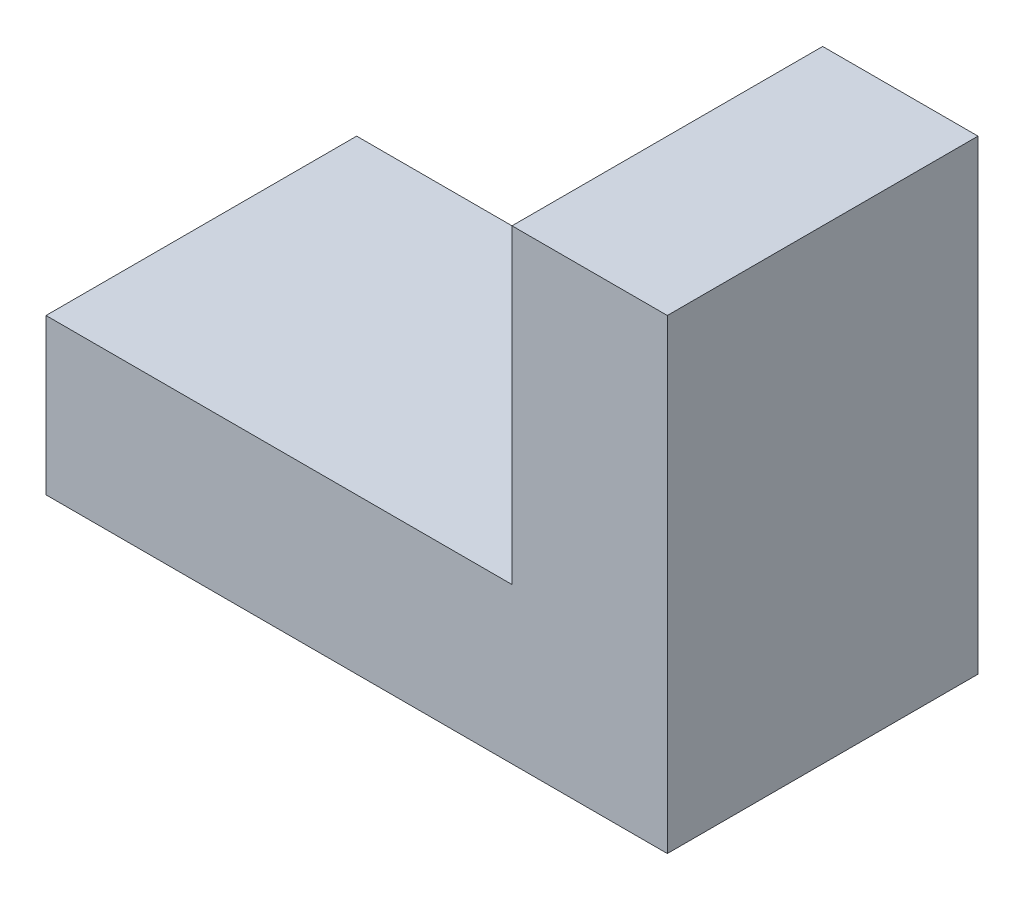
ISO-10303-21;
HEADER;
FILE_DESCRIPTION(('STEP AP214'),'2;1');
FILE_NAME('part.step','',(''),(''),'','','');
FILE_SCHEMA(('AUTOMOTIVE_DESIGN { 1 0 10303 214 1 1 1 1 }'));
ENDSEC;
DATA;
#1=APPLICATION_CONTEXT('core data for automotive mechanical design processes');
#2=APPLICATION_PROTOCOL_DEFINITION('international standard','automotive_design',2000,#1);
#3=PRODUCT_CONTEXT('',#1,'mechanical');
#4=PRODUCT('Part','Part','',(#3));
#5=PRODUCT_RELATED_PRODUCT_CATEGORY('part','',(#4));
#6=PRODUCT_DEFINITION_FORMATION('','',#4);
#7=PRODUCT_DEFINITION_CONTEXT('part definition',#1,'design');
#8=PRODUCT_DEFINITION('design','',#6,#7);
#9=PRODUCT_DEFINITION_SHAPE('','',#8);
#10=(LENGTH_UNIT() NAMED_UNIT(*) SI_UNIT(.MILLI.,.METRE.));
#11=(NAMED_UNIT(*) PLANE_ANGLE_UNIT() SI_UNIT($,.RADIAN.));
#12=(NAMED_UNIT(*) SI_UNIT($,.STERADIAN.) SOLID_ANGLE_UNIT());
#13=UNCERTAINTY_MEASURE_WITH_UNIT(LENGTH_MEASURE(1.E-05),#10,'distance_accuracy_value','');
#14=(GEOMETRIC_REPRESENTATION_CONTEXT(3) GLOBAL_UNCERTAINTY_ASSIGNED_CONTEXT((#13)) GLOBAL_UNIT_ASSIGNED_CONTEXT((#10,
#11,#12)) REPRESENTATION_CONTEXT('',''));
#15=CARTESIAN_POINT('',(0.,0.,0.));
#16=DIRECTION('',(0.,0.,1.));
#17=DIRECTION('',(1.,0.,0.));
#18=AXIS2_PLACEMENT_3D('',#15,#16,#17);
#19=CARTESIAN_POINT('',(-5.00000000000007,20.,10.));
#20=DIRECTION('',(-1.,0.,0.));
#21=DIRECTION('',(0.,0.,1.));
#22=AXIS2_PLACEMENT_3D('',#19,#20,#21);
#23=PLANE('',#22);
#24=DIRECTION('',(0.,-1.,0.));
#25=VECTOR('',#24,1.);
#26=CARTESIAN_POINT('',(-5.,20.,20.));
#27=LINE('',#26,#25);
#28=CARTESIAN_POINT('',(-5.,20.,20.));
#29=VERTEX_POINT('',#28);
#30=CARTESIAN_POINT('',(-5.,5.,20.));
#31=VERTEX_POINT('',#30);
#32=EDGE_CURVE('E119',#29,#31,#27,.T.);
#33=ORIENTED_EDGE('',*,*,#32,.T.);
#34=DIRECTION('',(0.,0.,1.));
#35=VECTOR('',#34,1.);
#36=CARTESIAN_POINT('',(-5.00000000000007,5.,10.));
#37=LINE('',#36,#35);
#38=CARTESIAN_POINT('',(-5.00000000000007,5.,10.));
#39=VERTEX_POINT('',#38);
#40=EDGE_CURVE('E11',#39,#31,#37,.T.);
#41=ORIENTED_EDGE('',*,*,#40,.F.);
#42=DIRECTION('',(0.,-1.,0.));
#43=VECTOR('',#42,1.);
#44=CARTESIAN_POINT('',(-5.00000000000007,20.,10.));
#45=LINE('',#44,#43);
#46=CARTESIAN_POINT('',(-5.00000000000007,20.,10.));
#47=VERTEX_POINT('',#46);
#48=EDGE_CURVE('E129',#47,#39,#45,.T.);
#49=ORIENTED_EDGE('',*,*,#48,.F.);
#50=DIRECTION('',(0.,0.,1.));
#51=VECTOR('',#50,1.);
#52=CARTESIAN_POINT('',(-5.00000000000007,20.,10.));
#53=LINE('',#52,#51);
#54=EDGE_CURVE('E115',#47,#29,#53,.T.);
#55=ORIENTED_EDGE('',*,*,#54,.T.);
#56=EDGE_LOOP('',(#33,#41,#49,#55));
#57=FACE_BOUND('',#56,.T.);
#58=ADVANCED_FACE('F35',(#57),#23,.F.);
#59=CARTESIAN_POINT('',(-5.00000000000007,5.,10.));
#60=DIRECTION('',(0.,1.,0.));
#61=DIRECTION('',(0.,0.,1.));
#62=AXIS2_PLACEMENT_3D('',#59,#60,#61);
#63=PLANE('',#62);
#64=DIRECTION('',(-1.,0.,0.));
#65=VECTOR('',#64,1.);
#66=CARTESIAN_POINT('',(-5.,5.,20.));
#67=LINE('',#66,#65);
#68=CARTESIAN_POINT('',(-25.,5.,20.0000000000002));
#69=VERTEX_POINT('',#68);
#70=EDGE_CURVE('E122',#31,#69,#67,.T.);
#71=ORIENTED_EDGE('',*,*,#70,.T.);
#72=DIRECTION('',(0.,0.,1.));
#73=VECTOR('',#72,1.);
#74=CARTESIAN_POINT('',(-25.0000000000001,5.,10.0000000000002));
#75=LINE('',#74,#73);
#76=CARTESIAN_POINT('',(-25.0000000000001,5.,10.0000000000002));
#77=VERTEX_POINT('',#76);
#78=EDGE_CURVE('E43',#77,#69,#75,.T.);
#79=ORIENTED_EDGE('',*,*,#78,.F.);
#80=DIRECTION('',(-1.,0.,0.));
#81=VECTOR('',#80,1.);
#82=CARTESIAN_POINT('',(-5.00000000000007,5.,10.));
#83=LINE('',#82,#81);
#84=EDGE_CURVE('E88',#39,#77,#83,.T.);
#85=ORIENTED_EDGE('',*,*,#84,.F.);
#86=ORIENTED_EDGE('',*,*,#40,.T.);
#87=EDGE_LOOP('',(#71,#79,#85,#86));
#88=FACE_BOUND('',#87,.T.);
#89=ADVANCED_FACE('F153',(#88),#63,.F.);
#90=CARTESIAN_POINT('',(-25.0000000000001,5.,10.0000000000002));
#91=DIRECTION('',(1.,0.,0.));
#92=DIRECTION('',(0.,0.,-1.));
#93=AXIS2_PLACEMENT_3D('',#90,#91,#92);
#94=PLANE('',#93);
#95=DIRECTION('',(0.,1.,0.));
#96=VECTOR('',#95,1.);
#97=CARTESIAN_POINT('',(-25.,5.,20.0000000000002));
#98=LINE('',#97,#96);
#99=CARTESIAN_POINT('',(-25.,10.,20.0000000000002));
#100=VERTEX_POINT('',#99);
#101=EDGE_CURVE('E124',#69,#100,#98,.T.);
#102=ORIENTED_EDGE('',*,*,#101,.T.);
#103=DIRECTION('',(0.,0.,1.));
#104=VECTOR('',#103,1.);
#105=CARTESIAN_POINT('',(-25.0000000000001,10.,10.0000000000002));
#106=LINE('',#105,#104);
#107=CARTESIAN_POINT('',(-25.0000000000001,10.,10.0000000000002));
#108=VERTEX_POINT('',#107);
#109=EDGE_CURVE('E110',#108,#100,#106,.T.);
#110=ORIENTED_EDGE('',*,*,#109,.F.);
#111=DIRECTION('',(0.,1.,0.));
#112=VECTOR('',#111,1.);
#113=CARTESIAN_POINT('',(-25.0000000000001,5.,10.0000000000002));
#114=LINE('',#113,#112);
#115=EDGE_CURVE('E101',#77,#108,#114,.T.);
#116=ORIENTED_EDGE('',*,*,#115,.F.);
#117=ORIENTED_EDGE('',*,*,#78,.T.);
#118=EDGE_LOOP('',(#102,#110,#116,#117));
#119=FACE_BOUND('',#118,.T.);
#120=ADVANCED_FACE('F135',(#119),#94,.F.);
#121=CARTESIAN_POINT('',(-25.0000000000001,10.,10.0000000000002));
#122=DIRECTION('',(0.,-1.,0.));
#123=DIRECTION('',(0.,0.,-1.));
#124=AXIS2_PLACEMENT_3D('',#121,#122,#123);
#125=PLANE('',#124);
#126=DIRECTION('',(1.,0.,0.));
#127=VECTOR('',#126,1.);
#128=CARTESIAN_POINT('',(-25.,10.,20.0000000000002));
#129=LINE('',#128,#127);
#130=CARTESIAN_POINT('',(-10.,10.,20.0000000000001));
#131=VERTEX_POINT('',#130);
#132=EDGE_CURVE('E109',#100,#131,#129,.T.);
#133=ORIENTED_EDGE('',*,*,#132,.T.);
#134=DIRECTION('',(0.,0.,1.));
#135=VECTOR('',#134,1.);
#136=CARTESIAN_POINT('',(-10.0000000000001,10.,10.0000000000001));
#137=LINE('',#136,#135);
#138=CARTESIAN_POINT('',(-10.0000000000001,10.,10.0000000000001));
#139=VERTEX_POINT('',#138);
#140=EDGE_CURVE('E106',#139,#131,#137,.T.);
#141=ORIENTED_EDGE('',*,*,#140,.F.);
#142=DIRECTION('',(1.,0.,0.));
#143=VECTOR('',#142,1.);
#144=CARTESIAN_POINT('',(-25.0000000000001,10.,10.0000000000002));
#145=LINE('',#144,#143);
#146=EDGE_CURVE('E95',#108,#139,#145,.T.);
#147=ORIENTED_EDGE('',*,*,#146,.F.);
#148=ORIENTED_EDGE('',*,*,#109,.T.);
#149=EDGE_LOOP('',(#133,#141,#147,#148));
#150=FACE_BOUND('',#149,.T.);
#151=ADVANCED_FACE('F107',(#150),#125,.F.);
#152=CARTESIAN_POINT('',(-10.0000000000001,10.,10.0000000000001));
#153=DIRECTION('',(1.,0.,0.));
#154=DIRECTION('',(0.,0.,-1.));
#155=AXIS2_PLACEMENT_3D('',#152,#153,#154);
#156=PLANE('',#155);
#157=DIRECTION('',(0.,1.,0.));
#158=VECTOR('',#157,1.);
#159=CARTESIAN_POINT('',(-10.,10.,20.0000000000001));
#160=LINE('',#159,#158);
#161=CARTESIAN_POINT('',(-10.,20.,20.0000000000001));
#162=VERTEX_POINT('',#161);
#163=EDGE_CURVE('E74',#131,#162,#160,.T.);
#164=ORIENTED_EDGE('',*,*,#163,.T.);
#165=DIRECTION('',(0.,0.,1.));
#166=VECTOR('',#165,1.);
#167=CARTESIAN_POINT('',(-10.0000000000001,20.,10.0000000000001));
#168=LINE('',#167,#166);
#169=CARTESIAN_POINT('',(-10.0000000000001,20.,10.0000000000001));
#170=VERTEX_POINT('',#169);
#171=EDGE_CURVE('E111',#170,#162,#168,.T.);
#172=ORIENTED_EDGE('',*,*,#171,.F.);
#173=DIRECTION('',(0.,1.,0.));
#174=VECTOR('',#173,1.);
#175=CARTESIAN_POINT('',(-10.0000000000001,10.,10.0000000000001));
#176=LINE('',#175,#174);
#177=EDGE_CURVE('E99',#139,#170,#176,.T.);
#178=ORIENTED_EDGE('',*,*,#177,.F.);
#179=ORIENTED_EDGE('',*,*,#140,.T.);
#180=EDGE_LOOP('',(#164,#172,#178,#179));
#181=FACE_BOUND('',#180,.T.);
#182=ADVANCED_FACE('F113',(#181),#156,.F.);
#183=CARTESIAN_POINT('',(-10.0000000000001,20.,10.0000000000001));
#184=DIRECTION('',(0.,-1.,0.));
#185=DIRECTION('',(0.,0.,-1.));
#186=AXIS2_PLACEMENT_3D('',#183,#184,#185);
#187=PLANE('',#186);
#188=DIRECTION('',(1.,0.,0.));
#189=VECTOR('',#188,1.);
#190=CARTESIAN_POINT('',(-10.,20.,20.0000000000001));
#191=LINE('',#190,#189);
#192=EDGE_CURVE('E80',#162,#29,#191,.T.);
#193=ORIENTED_EDGE('',*,*,#192,.T.);
#194=ORIENTED_EDGE('',*,*,#54,.F.);
#195=DIRECTION('',(1.,0.,0.));
#196=VECTOR('',#195,1.);
#197=CARTESIAN_POINT('',(-10.0000000000001,20.,10.0000000000001));
#198=LINE('',#197,#196);
#199=EDGE_CURVE('E51',#170,#47,#198,.T.);
#200=ORIENTED_EDGE('',*,*,#199,.F.);
#201=ORIENTED_EDGE('',*,*,#171,.T.);
#202=EDGE_LOOP('',(#193,#194,#200,#201));
#203=FACE_BOUND('',#202,.T.);
#204=ADVANCED_FACE('F142',(#203),#187,.F.);
#205=CARTESIAN_POINT('',(0.,0.,10.));
#206=DIRECTION('',(0.,0.,-1.));
#207=DIRECTION('',(-1.,0.,0.));
#208=AXIS2_PLACEMENT_3D('',#205,#206,#207);
#209=PLANE('',#208);
#210=ORIENTED_EDGE('',*,*,#48,.T.);
#211=ORIENTED_EDGE('',*,*,#84,.T.);
#212=ORIENTED_EDGE('',*,*,#115,.T.);
#213=ORIENTED_EDGE('',*,*,#146,.T.);
#214=ORIENTED_EDGE('',*,*,#177,.T.);
#215=ORIENTED_EDGE('',*,*,#199,.T.);
#216=EDGE_LOOP('',(#210,#211,#212,#213,#214,#215));
#217=FACE_BOUND('',#216,.T.);
#218=ADVANCED_FACE('F97',(#217),#209,.T.);
#219=CARTESIAN_POINT('',(1.38777878078145E-13,0.,20.));
#220=DIRECTION('',(0.,0.,-1.));
#221=DIRECTION('',(-1.,0.,0.));
#222=AXIS2_PLACEMENT_3D('',#219,#220,#221);
#223=PLANE('',#222);
#224=ORIENTED_EDGE('',*,*,#32,.F.);
#225=ORIENTED_EDGE('',*,*,#192,.F.);
#226=ORIENTED_EDGE('',*,*,#163,.F.);
#227=ORIENTED_EDGE('',*,*,#132,.F.);
#228=ORIENTED_EDGE('',*,*,#101,.F.);
#229=ORIENTED_EDGE('',*,*,#70,.F.);
#230=EDGE_LOOP('',(#224,#225,#226,#227,#228,#229));
#231=FACE_BOUND('',#230,.T.);
#232=ADVANCED_FACE('F138',(#231),#223,.F.);
#233=CLOSED_SHELL('',(#58,#89,#120,#151,#182,#204,#218,#232));
#234=MANIFOLD_SOLID_BREP('B2',#233);
#235=ADVANCED_BREP_SHAPE_REPRESENTATION('',(#18,#234),#14);
#236=SHAPE_DEFINITION_REPRESENTATION(#9,#235);
ENDSEC;
END-ISO-10303-21;
